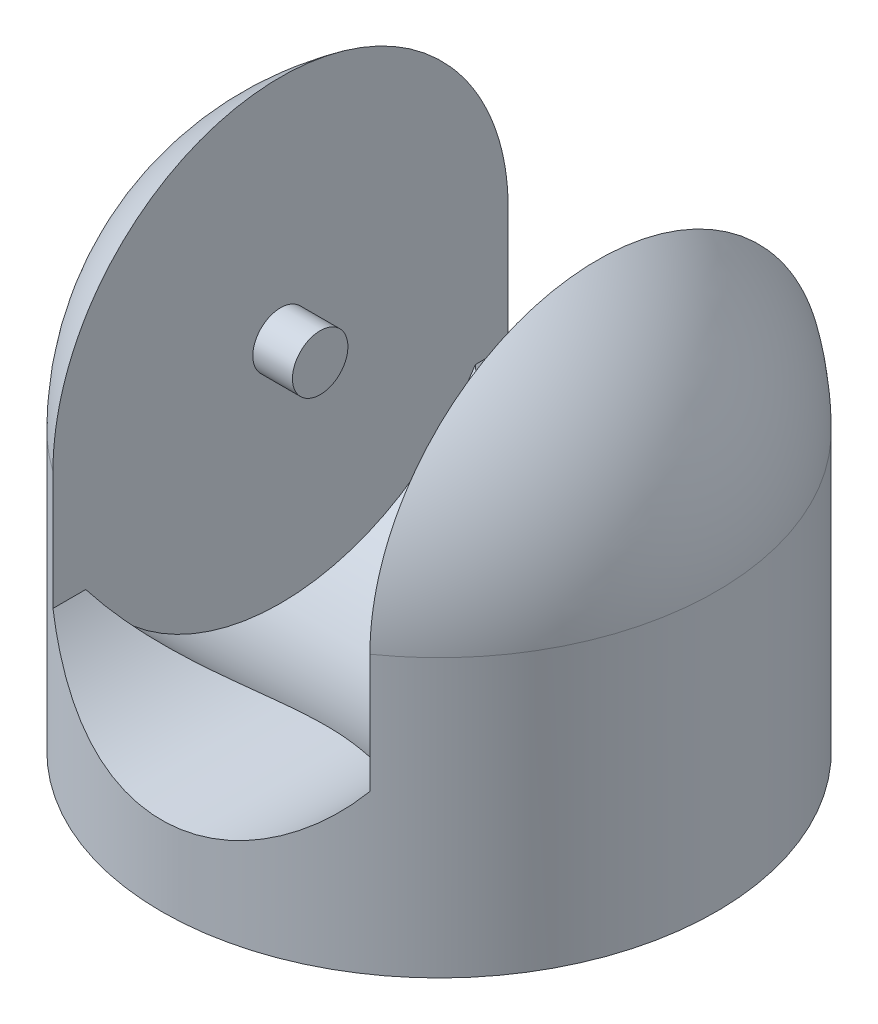
ISO-10303-21;
HEADER;
FILE_DESCRIPTION(('STEP AP214'),'2;1');
FILE_NAME('part.step','',(''),(''),'','','');
FILE_SCHEMA(('AUTOMOTIVE_DESIGN { 1 0 10303 214 1 1 1 1 }'));
ENDSEC;
DATA;
#1=APPLICATION_CONTEXT('core data for automotive mechanical design processes');
#2=APPLICATION_PROTOCOL_DEFINITION('international standard','automotive_design',2000,#1);
#3=PRODUCT_CONTEXT('',#1,'mechanical');
#4=PRODUCT('Part','Part','',(#3));
#5=PRODUCT_RELATED_PRODUCT_CATEGORY('part','',(#4));
#6=PRODUCT_DEFINITION_FORMATION('','',#4);
#7=PRODUCT_DEFINITION_CONTEXT('part definition',#1,'design');
#8=PRODUCT_DEFINITION('design','',#6,#7);
#9=PRODUCT_DEFINITION_SHAPE('','',#8);
#10=(LENGTH_UNIT() NAMED_UNIT(*) SI_UNIT(.MILLI.,.METRE.));
#11=(NAMED_UNIT(*) PLANE_ANGLE_UNIT() SI_UNIT($,.RADIAN.));
#12=(NAMED_UNIT(*) SI_UNIT($,.STERADIAN.) SOLID_ANGLE_UNIT());
#13=UNCERTAINTY_MEASURE_WITH_UNIT(LENGTH_MEASURE(1.E-05),#10,'distance_accuracy_value','');
#14=(GEOMETRIC_REPRESENTATION_CONTEXT(3) GLOBAL_UNCERTAINTY_ASSIGNED_CONTEXT((#13)) GLOBAL_UNIT_ASSIGNED_CONTEXT((#10,
#11,#12)) REPRESENTATION_CONTEXT('',''));
#15=CARTESIAN_POINT('',(0.,0.,0.));
#16=DIRECTION('',(0.,0.,1.));
#17=DIRECTION('',(1.,0.,0.));
#18=AXIS2_PLACEMENT_3D('',#15,#16,#17);
#19=CARTESIAN_POINT('',(-20.,70.,-28.7228132326902));
#20=DIRECTION('',(-1.,0.,0.));
#21=DIRECTION('',(0.,0.,1.));
#22=AXIS2_PLACEMENT_3D('',#19,#20,#21);
#23=PLANE('',#22);
#24=DIRECTION('',(0.,-1.,0.));
#25=VECTOR('',#24,1.);
#26=CARTESIAN_POINT('',(-20.,70.,28.7228132326902));
#27=LINE('',#26,#25);
#28=CARTESIAN_POINT('',(-20.,35.,28.7228132326901));
#29=VERTEX_POINT('',#28);
#30=CARTESIAN_POINT('',(-20.,20.,28.7228132326902));
#31=VERTEX_POINT('',#30);
#32=EDGE_CURVE('E121',#29,#31,#27,.T.);
#33=ORIENTED_EDGE('',*,*,#32,.T.);
#34=DIRECTION('',(0.,0.,1.));
#35=VECTOR('',#34,1.);
#36=CARTESIAN_POINT('',(-20.,20.,-35.001));
#37=LINE('',#36,#35);
#38=CARTESIAN_POINT('',(-20.,20.,24.584133540962));
#39=VERTEX_POINT('',#38);
#40=EDGE_CURVE('E109',#39,#31,#37,.T.);
#41=ORIENTED_EDGE('',*,*,#40,.F.);
#42=CARTESIAN_POINT('',(-20.,35.,0.));
#43=DIRECTION('',(1.,0.,0.));
#44=DIRECTION('',(0.,0.,-1.));
#45=AXIS2_PLACEMENT_3D('',#42,#43,#44);
#46=CIRCLE('',#45,28.7989517510595);
#47=CARTESIAN_POINT('',(-20.,20.,-24.584133540962));
#48=VERTEX_POINT('',#47);
#49=EDGE_CURVE('E94',#39,#48,#46,.T.);
#50=ORIENTED_EDGE('',*,*,#49,.T.);
#51=CARTESIAN_POINT('',(-20.,20.,-28.7228132326902));
#52=VERTEX_POINT('',#51);
#53=EDGE_CURVE('E103',#52,#48,#37,.T.);
#54=ORIENTED_EDGE('',*,*,#53,.F.);
#55=DIRECTION('',(0.,-1.,0.));
#56=VECTOR('',#55,1.);
#57=CARTESIAN_POINT('',(-20.,70.,-28.7228132326901));
#58=LINE('',#57,#56);
#59=CARTESIAN_POINT('',(-20.,35.,-28.7228132326902));
#60=VERTEX_POINT('',#59);
#61=EDGE_CURVE('E57',#60,#52,#58,.T.);
#62=ORIENTED_EDGE('',*,*,#61,.F.);
#63=CARTESIAN_POINT('',(-20.,35.,0.));
#64=DIRECTION('',(-1.,0.,0.));
#65=DIRECTION('',(0.,0.,1.));
#66=AXIS2_PLACEMENT_3D('',#63,#64,#65);
#67=CIRCLE('',#66,28.7228132326902);
#68=EDGE_CURVE('E130',#60,#29,#67,.F.);
#69=ORIENTED_EDGE('',*,*,#68,.T.);
#70=EDGE_LOOP('',(#33,#41,#50,#54,#62,#69));
#71=FACE_BOUND('',#70,.T.);
#72=CARTESIAN_POINT('',(-20.,35.,0.));
#73=DIRECTION('',(-1.,0.,0.));
#74=DIRECTION('',(0.,0.,1.));
#75=AXIS2_PLACEMENT_3D('',#72,#73,#74);
#76=CIRCLE('',#75,3.5);
#77=CARTESIAN_POINT('',(-20.,35.,3.5));
#78=VERTEX_POINT('',#77);
#79=EDGE_CURVE('E11',#78,#78,#76,.F.);
#80=ORIENTED_EDGE('',*,*,#79,.F.);
#81=EDGE_LOOP('',(#80));
#82=FACE_BOUND('',#81,.T.);
#83=ADVANCED_FACE('F34',(#71,#82),#23,.F.);
#84=CARTESIAN_POINT('',(20.,70.,-28.7228132326902));
#85=DIRECTION('',(1.,0.,0.));
#86=DIRECTION('',(0.,0.,-1.));
#87=AXIS2_PLACEMENT_3D('',#84,#85,#86);
#88=PLANE('',#87);
#89=DIRECTION('',(0.,-1.,0.));
#90=VECTOR('',#89,1.);
#91=CARTESIAN_POINT('',(20.,70.,-28.7228132326902));
#92=LINE('',#91,#90);
#93=CARTESIAN_POINT('',(20.,35.,-28.7228132326902));
#94=VERTEX_POINT('',#93);
#95=CARTESIAN_POINT('',(20.,20.,-28.7228132326902));
#96=VERTEX_POINT('',#95);
#97=EDGE_CURVE('E108',#94,#96,#92,.T.);
#98=ORIENTED_EDGE('',*,*,#97,.T.);
#99=DIRECTION('',(0.,0.,1.));
#100=VECTOR('',#99,1.);
#101=CARTESIAN_POINT('',(20.,20.,-35.001));
#102=LINE('',#101,#100);
#103=CARTESIAN_POINT('',(20.,20.,-24.584133540962));
#104=VERTEX_POINT('',#103);
#105=EDGE_CURVE('E101',#96,#104,#102,.T.);
#106=ORIENTED_EDGE('',*,*,#105,.T.);
#107=CARTESIAN_POINT('',(20.,35.,0.));
#108=DIRECTION('',(1.,0.,0.));
#109=DIRECTION('',(0.,0.,-1.));
#110=AXIS2_PLACEMENT_3D('',#107,#108,#109);
#111=CIRCLE('',#110,28.7989517510595);
#112=CARTESIAN_POINT('',(20.,20.,24.584133540962));
#113=VERTEX_POINT('',#112);
#114=EDGE_CURVE('E49',#113,#104,#111,.T.);
#115=ORIENTED_EDGE('',*,*,#114,.F.);
#116=CARTESIAN_POINT('',(20.,20.,28.7228132326902));
#117=VERTEX_POINT('',#116);
#118=EDGE_CURVE('E110',#113,#117,#102,.T.);
#119=ORIENTED_EDGE('',*,*,#118,.T.);
#120=DIRECTION('',(0.,-1.,0.));
#121=VECTOR('',#120,1.);
#122=CARTESIAN_POINT('',(20.,70.,28.7228132326902));
#123=LINE('',#122,#121);
#124=CARTESIAN_POINT('',(20.,35.,28.7228132326901));
#125=VERTEX_POINT('',#124);
#126=EDGE_CURVE('E116',#125,#117,#123,.T.);
#127=ORIENTED_EDGE('',*,*,#126,.F.);
#128=CARTESIAN_POINT('',(20.,35.,0.));
#129=DIRECTION('',(1.,0.,0.));
#130=DIRECTION('',(0.,0.,-1.));
#131=AXIS2_PLACEMENT_3D('',#128,#129,#130);
#132=CIRCLE('',#131,28.7228132326902);
#133=EDGE_CURVE('E132',#125,#94,#132,.F.);
#134=ORIENTED_EDGE('',*,*,#133,.T.);
#135=EDGE_LOOP('',(#98,#106,#115,#119,#127,#134));
#136=FACE_BOUND('',#135,.T.);
#137=CARTESIAN_POINT('',(20.,35.,0.));
#138=DIRECTION('',(1.,0.,0.));
#139=DIRECTION('',(0.,0.,-1.));
#140=AXIS2_PLACEMENT_3D('',#137,#138,#139);
#141=CIRCLE('',#140,3.5);
#142=CARTESIAN_POINT('',(20.,35.,-3.5));
#143=VERTEX_POINT('',#142);
#144=EDGE_CURVE('E42',#143,#143,#141,.F.);
#145=ORIENTED_EDGE('',*,*,#144,.F.);
#146=EDGE_LOOP('',(#145));
#147=FACE_BOUND('',#146,.T.);
#148=ADVANCED_FACE('F105',(#136,#147),#88,.F.);
#149=CARTESIAN_POINT('',(0.,35.,-35.001));
#150=DIRECTION('',(0.,0.,1.));
#151=DIRECTION('',(1.,0.,0.));
#152=AXIS2_PLACEMENT_3D('',#149,#150,#151);
#153=CYLINDRICAL_SURFACE('',#152,25.);
#154=CARTESIAN_POINT('',(20.,20.,-24.584133540962));
#155=CARTESIAN_POINT('',(19.7589653789636,19.6786366468955,-24.3880564833541));
#156=CARTESIAN_POINT('',(19.5114349361079,19.3647169685228,-24.1878689528644));
#157=CARTESIAN_POINT('',(19.0040804331311,18.7518221809919,-23.7804894937621));
#158=CARTESIAN_POINT('',(18.7442586649229,18.4528443069112,-23.5732988730279));
#159=CARTESIAN_POINT('',(18.2130593881842,17.8699134903597,-23.1531587875243));
#160=CARTESIAN_POINT('',(17.9416875908679,17.5859532742746,-22.9402121875294));
#161=CARTESIAN_POINT('',(17.3877921141745,17.0328672121599,-22.5096571640812));
#162=CARTESIAN_POINT('',(17.1052678778502,16.7637421086007,-22.292048508056));
#163=CARTESIAN_POINT('',(16.2368961770555,15.9742576457032,-21.630402596932));
#164=CARTESIAN_POINT('',(15.6344501435017,15.4763853121027,-21.1808943088864));
#165=CARTESIAN_POINT('',(14.6996071008935,14.7744388551671,-20.5039555667599));
#166=CARTESIAN_POINT('',(14.3827663484432,14.5479148387515,-20.2778422356288));
#167=CARTESIAN_POINT('',(13.7385898907949,14.1097421789252,-19.8261371751175));
#168=CARTESIAN_POINT('',(13.411254636511,13.8980928976404,-19.6005454237721));
#169=CARTESIAN_POINT('',(12.5784043993165,13.3868465979377,-19.0383641858032));
#170=CARTESIAN_POINT('',(12.0661819698894,13.0966422175,-18.7030949092357));
#171=CARTESIAN_POINT('',(11.0167362555379,12.5504673895574,-18.0438723349398));
#172=CARTESIAN_POINT('',(10.479511483911,12.2944989813246,-17.7199197121385));
#173=CARTESIAN_POINT('',(9.37975019250803,11.8185777383216,-17.0925602673537));
#174=CARTESIAN_POINT('',(8.8172876150202,11.5985274632825,-16.7890992136669));
#175=CARTESIAN_POINT('',(7.95239222705756,11.2965728366188,-16.3572050987599));
#176=CARTESIAN_POINT('',(7.66062957084739,11.2006268886144,-16.2171527771733));
#177=CARTESIAN_POINT('',(7.06976487628542,11.0184618654417,-15.9465380614054));
#178=CARTESIAN_POINT('',(6.77066148742319,10.9322445966876,-15.8159774312302));
#179=CARTESIAN_POINT('',(5.74786213349781,10.658336029013,-15.3944063650927));
#180=CARTESIAN_POINT('',(5.00593241700046,10.4941526903562,-15.1296629003441));
#181=CARTESIAN_POINT('',(3.86520825472443,10.2975944851878,-14.8049650337621));
#182=CARTESIAN_POINT('',(3.48071665635592,10.2403928182495,-14.7088604508359));
#183=CARTESIAN_POINT('',(2.70349877245001,10.1435263254106,-14.5445668408579));
#184=CARTESIAN_POINT('',(2.31077278183142,10.1038608725618,-14.4763768158217));
#185=CARTESIAN_POINT('',(1.51506527539025,10.0427241612041,-14.3707288670768));
#186=CARTESIAN_POINT('',(1.11201759053807,10.021470143467,-14.3336380496131));
#187=CARTESIAN_POINT('',(0.303669194317217,9.99857556550272,-14.2936680916078));
#188=CARTESIAN_POINT('',(-0.101631350491607,9.99693357410638,-14.2907864546833));
#189=CARTESIAN_POINT('',(-0.910857478856325,10.0133188124471,-14.3194148966694));
#190=CARTESIAN_POINT('',(-1.3147820097582,10.0313587003671,-14.3509471084704));
#191=CARTESIAN_POINT('',(-2.11741342144235,10.0865800495237,-14.4465953818876));
#192=CARTESIAN_POINT('',(-2.516119416571,10.1237647177711,-14.5107169026328));
#193=CARTESIAN_POINT('',(-3.37177773736056,10.2240740567088,-14.681432743667));
#194=CARTESIAN_POINT('',(-3.82727293240221,10.2905052697267,-14.7933498053317));
#195=CARTESIAN_POINT('',(-4.72466502388315,10.4462796777479,-15.0504792129497));
#196=CARTESIAN_POINT('',(-5.16655817444798,10.5356291220962,-15.1957006391936));
#197=CARTESIAN_POINT('',(-6.03710471933982,10.7357556679278,-15.5132646273062));
#198=CARTESIAN_POINT('',(-6.46570885586816,10.8466034792206,-15.6856963272074));
#199=CARTESIAN_POINT('',(-7.30832545950768,11.0880662009588,-16.0513878032181));
#200=CARTESIAN_POINT('',(-7.72233177795081,11.2186893210746,-16.2446562200015));
#201=CARTESIAN_POINT('',(-8.47915783042321,11.4789284468832,-16.6187623968556));
#202=CARTESIAN_POINT('',(-8.82383317822576,11.6061284298613,-16.7975561313935));
#203=CARTESIAN_POINT('',(-9.50304557815312,11.8737091128119,-17.1640835933644));
#204=CARTESIAN_POINT('',(-9.8375846450484,12.0140871703645,-17.3518155248377));
#205=CARTESIAN_POINT('',(-10.4972704183337,12.3077597406237,-17.7341477402505));
#206=CARTESIAN_POINT('',(-10.8224103334665,12.4610632940033,-17.9287527753262));
#207=CARTESIAN_POINT('',(-11.4634489488312,12.7802450803104,-18.322840456102));
#208=CARTESIAN_POINT('',(-11.7793466289606,12.9461246941055,-18.5223236357948));
#209=CARTESIAN_POINT('',(-12.7134706260121,13.4622623677701,-19.1255091405389));
#210=CARTESIAN_POINT('',(-13.3183835976166,13.8311336268286,-19.5340985662206));
#211=CARTESIAN_POINT('',(-14.4934675724428,14.6176818565859,-20.3534628155087));
#212=CARTESIAN_POINT('',(-15.0636522165604,15.0353394739937,-20.7642367112398));
#213=CARTESIAN_POINT('',(-16.0218305731036,15.8018148170097,-21.4710046379384));
#214=CARTESIAN_POINT('',(-16.4178780674206,16.1393099516465,-21.7684097324855));
#215=CARTESIAN_POINT('',(-17.1905735942009,16.84080381236,-22.3569402484533));
#216=CARTESIAN_POINT('',(-17.5672253219851,17.2047974577511,-22.6480668598746));
#217=CARTESIAN_POINT('',(-18.2991907589498,17.9584374903988,-23.2204222198885));
#218=CARTESIAN_POINT('',(-18.6545610261832,18.3480095352001,-23.5016762988118));
#219=CARTESIAN_POINT('',(-19.3438137178225,19.1539364228621,-24.052450458555));
#220=CARTESIAN_POINT('',(-19.6776860259696,19.5703036930909,-24.3219649960966));
#221=CARTESIAN_POINT('',(-20.,20.,-24.584133540962));
#222=B_SPLINE_CURVE_WITH_KNOTS('',3,(#154,#155,#156,#157,#158,#159,#160,#161,#162,#163,#164,
#165,#166,#167,#168,#169,#170,#171,#172,#173,#174,#175,#176,#177,#178,#179,#180,#181,#182,#183,
#184,#185,#186,#187,#188,#189,#190,#191,#192,#193,#194,#195,#196,#197,#198,#199,#200,#201,#202,
#203,#204,#205,#206,#207,#208,#209,#210,#211,#212,#213,#214,#215,#216,#217,#218,#219,#220,#221),
.UNSPECIFIED.,.F.,.F.,(4,2,2,2,2,2,2,2,2,2,2,2,2,2,2,2,2,2,2,2,2,2,2,2,2,2,2,2,2,2,2,2,2,4),(0.,
1.34083418658437,2.68141933131193,4.02134911966647,5.36134590830584,8.06248486995453,
9.41330418959865,10.7640655466025,12.7951363068786,14.826327994447,16.8519143471984,
17.8642429496709,18.8767592123561,21.2817109757442,22.4818508998739,23.6819479135765,
24.8960194609212,26.110002411988,27.3247665832532,28.5397343102622,29.9586469854788,
31.3779469819813,32.8019968556765,34.2266395495736,35.4519602603511,36.6770357969146,
37.902975430101,39.1290498685346,41.5802464840048,44.0304740040326,45.8276292414617,
47.6244408047136,49.416243291642,51.2088828733624),.UNSPECIFIED.);
#223=EDGE_CURVE('E88',#104,#48,#222,.T.);
#224=ORIENTED_EDGE('',*,*,#223,.F.);
#225=ORIENTED_EDGE('',*,*,#105,.F.);
#226=CARTESIAN_POINT('',(20.,20.,-28.7228132326902));
#227=CARTESIAN_POINT('',(19.7867962339921,19.7157430015077,-28.8712717207238));
#228=CARTESIAN_POINT('',(19.5677151221583,19.4362460841641,-29.0202922477165));
#229=CARTESIAN_POINT('',(19.1179059235667,18.8869055196819,-29.3185689368627));
#230=CARTESIAN_POINT('',(18.8871775930187,18.6170620748042,-29.4678251038848));
#231=CARTESIAN_POINT('',(18.1775107964694,17.8220204411887,-29.9147222896041));
#232=CARTESIAN_POINT('',(17.6812586784095,17.3115351365177,-30.2113736200101));
#233=CARTESIAN_POINT('',(16.6387448278238,16.3272573415269,-30.7979486038796));
#234=CARTESIAN_POINT('',(16.0920266241455,15.8538898732128,-31.0877734100756));
#235=CARTESIAN_POINT('',(14.954306369625,14.9526769048786,-31.6507730169713));
#236=CARTESIAN_POINT('',(14.363310896601,14.5248246658932,-31.9239502799336));
#237=CARTESIAN_POINT('',(13.1358689121121,13.7164023424612,-32.4483661287183));
#238=CARTESIAN_POINT('',(12.4992159229297,13.3360715653495,-32.6994919221283));
#239=CARTESIAN_POINT('',(11.1857605875011,12.6296021915462,-33.171760439479));
#240=CARTESIAN_POINT('',(10.5089559758877,12.3034666565206,-33.3929014693529));
#241=CARTESIAN_POINT('',(9.12231507425886,11.711609639635,-33.7979699877076));
#242=CARTESIAN_POINT('',(8.4126325401201,11.4456355861555,-33.9820526831074));
#243=CARTESIAN_POINT('',(6.96329660834398,10.9772606449588,-34.3083624793697));
#244=CARTESIAN_POINT('',(6.2236507608461,10.7748438532353,-34.4506000506228));
#245=CARTESIAN_POINT('',(4.82993892314189,10.4621541405979,-34.6712491830646));
#246=CARTESIAN_POINT('',(4.17888382128421,10.3428105895907,-34.7559017295164));
#247=CARTESIAN_POINT('',(2.86569486680995,10.1559377984981,-34.8887241302945));
#248=CARTESIAN_POINT('',(2.20356213029851,10.0884033702303,-34.9368976376375));
#249=CARTESIAN_POINT('',(0.874273029809522,10.0064172309871,-34.9954048484337));
#250=CARTESIAN_POINT('',(0.207116079249498,9.99197181759536,-35.0057340626789));
#251=CARTESIAN_POINT('',(-1.12568740919334,10.016466627178,-34.9882387259323));
#252=CARTESIAN_POINT('',(-1.79133406608786,10.0554024861974,-34.9604172937816));
#253=CARTESIAN_POINT('',(-3.02730731825966,10.1772554202841,-34.8735879130262));
#254=CARTESIAN_POINT('',(-3.59861524094893,10.253686739426,-34.8191826355172));
#255=CARTESIAN_POINT('',(-4.73141381489224,10.4450899903135,-34.6834116753889));
#256=CARTESIAN_POINT('',(-5.29290559242344,10.5600574695839,-34.6020491074324));
#257=CARTESIAN_POINT('',(-6.40245377638835,10.826996011538,-34.4140256091646));
#258=CARTESIAN_POINT('',(-6.95051459474932,10.9789547386781,-34.3073731126416));
#259=CARTESIAN_POINT('',(-8.03045417788177,11.3181043180312,-34.0707708709449));
#260=CARTESIAN_POINT('',(-8.56233201655212,11.5052971821946,-33.9408197953889));
#261=CARTESIAN_POINT('',(-9.62943898275283,11.9215342863996,-33.6540024012869));
#262=CARTESIAN_POINT('',(-10.1638662753343,12.1520088245027,-33.4962331933269));
#263=CARTESIAN_POINT('',(-11.21025741663,12.6468093723142,-33.1607007025862));
#264=CARTESIAN_POINT('',(-11.7222206006461,12.9111363827893,-32.9829368287305));
#265=CARTESIAN_POINT('',(-12.7226472594927,13.471797738056,-32.610114905573));
#266=CARTESIAN_POINT('',(-13.2110796609338,13.7681728148127,-32.4150349058213));
#267=CARTESIAN_POINT('',(-14.1625320097457,14.3906347533945,-32.0107781205752));
#268=CARTESIAN_POINT('',(-14.6255495071029,14.7167244716984,-31.8015999803259));
#269=CARTESIAN_POINT('',(-15.5462259244498,15.4126765633273,-31.3621911315634));
#270=CARTESIAN_POINT('',(-16.0026248380218,15.7838719457879,-31.1314334635424));
#271=CARTESIAN_POINT('',(-16.8857478077068,16.5550746337831,-30.6614054804088));
#272=CARTESIAN_POINT('',(-17.312469099194,16.9550846165011,-30.422134375355));
#273=CARTESIAN_POINT('',(-18.133989306158,17.7809310410455,-29.9396796325053));
#274=CARTESIAN_POINT('',(-18.5289041275662,18.2066627978581,-29.6965144700605));
#275=CARTESIAN_POINT('',(-19.0980722397497,18.8647054678806,-29.3311182161552));
#276=CARTESIAN_POINT('',(-19.2839141530429,19.0872759497597,-29.2092208053957));
#277=CARTESIAN_POINT('',(-19.6478127346763,19.5388393443364,-28.9656933891444));
#278=CARTESIAN_POINT('',(-19.8258693229324,19.7678323230596,-28.8440633864155));
#279=CARTESIAN_POINT('',(-20.,20.,-28.7228132326901));
#280=B_SPLINE_CURVE_WITH_KNOTS('',3,(#226,#227,#228,#229,#230,#231,#232,#233,#234,#235,#236,
#237,#238,#239,#240,#241,#242,#243,#244,#245,#246,#247,#248,#249,#250,#251,#252,#253,#254,#255,
#256,#257,#258,#259,#260,#261,#262,#263,#264,#265,#266,#267,#268,#269,#270,#271,#272,#273,#274,
#275,#276,#277,#278,#279),.UNSPECIFIED.,.F.,.F.,(4,2,2,2,2,2,2,2,2,2,2,2,2,2,2,2,2,2,2,2,2,2,2,
2,2,2,4),(0.,1.15512375906846,2.31027170629091,4.62147770219639,6.95614236370478,
9.29046087325038,11.6360974113601,13.9818664171148,16.3175966000099,18.652741843818,
20.6516794741274,22.6504169040279,24.6493914227111,26.6482025336243,28.3831036458536,
30.1178043763406,31.8519274233357,33.5861495228056,35.3933915222295,37.2006869607382,
39.0103070240176,40.8201012305859,42.7144117327994,44.6088984642307,46.4961357401291,
47.4396088702414,48.3830917031511),.UNSPECIFIED.);
#281=EDGE_CURVE('E123',#96,#52,#280,.T.);
#282=ORIENTED_EDGE('',*,*,#281,.T.);
#283=ORIENTED_EDGE('',*,*,#53,.T.);
#284=EDGE_LOOP('',(#224,#225,#282,#283));
#285=FACE_BOUND('',#284,.T.);
#286=ADVANCED_FACE('F99',(#285),#153,.F.);
#287=CARTESIAN_POINT('',(-20.,20.,24.584133540962));
#288=CARTESIAN_POINT('',(-19.7589653789637,19.6786366468955,24.3880564833541));
#289=CARTESIAN_POINT('',(-19.5114349361079,19.3647169685228,24.1878689528644));
#290=CARTESIAN_POINT('',(-19.0040804331311,18.7518221809919,23.7804894937621));
#291=CARTESIAN_POINT('',(-18.7442586649229,18.4528443069112,23.5732988730279));
#292=CARTESIAN_POINT('',(-18.2130593881842,17.8699134903597,23.1531587875243));
#293=CARTESIAN_POINT('',(-17.9416875908679,17.5859532742746,22.9402121875294));
#294=CARTESIAN_POINT('',(-17.3877921141745,17.0328672121599,22.5096571640812));
#295=CARTESIAN_POINT('',(-17.1052678778503,16.7637421086007,22.292048508056));
#296=CARTESIAN_POINT('',(-16.2368961770555,15.9742576457032,21.6304025969319));
#297=CARTESIAN_POINT('',(-15.6344501435017,15.4763853121027,21.1808943088864));
#298=CARTESIAN_POINT('',(-14.6996071008935,14.7744388551671,20.5039555667599));
#299=CARTESIAN_POINT('',(-14.3827663484432,14.5479148387515,20.2778422356288));
#300=CARTESIAN_POINT('',(-13.738589890795,14.1097421789252,19.8261371751175));
#301=CARTESIAN_POINT('',(-13.411254636511,13.8980928976404,19.6005454237721));
#302=CARTESIAN_POINT('',(-12.5784043993165,13.3868465979377,19.0383641858032));
#303=CARTESIAN_POINT('',(-12.0661819698895,13.0966422175,18.7030949092357));
#304=CARTESIAN_POINT('',(-11.0167362555379,12.5504673895574,18.0438723349398));
#305=CARTESIAN_POINT('',(-10.479511483911,12.2944989813246,17.7199197121385));
#306=CARTESIAN_POINT('',(-9.37975019250804,11.8185777383216,17.0925602673537));
#307=CARTESIAN_POINT('',(-8.8172876150202,11.5985274632825,16.7890992136668));
#308=CARTESIAN_POINT('',(-7.95239222705757,11.2965728366188,16.3572050987599));
#309=CARTESIAN_POINT('',(-7.6606295708474,11.2006268886144,16.2171527771733));
#310=CARTESIAN_POINT('',(-7.06976487628543,11.0184618654417,15.9465380614054));
#311=CARTESIAN_POINT('',(-6.7706614874232,10.9322445966876,15.8159774312302));
#312=CARTESIAN_POINT('',(-5.74786213349781,10.658336029013,15.3944063650927));
#313=CARTESIAN_POINT('',(-5.00593241700046,10.4941526903562,15.1296629003441));
#314=CARTESIAN_POINT('',(-3.86520825472443,10.2975944851878,14.804965033762));
#315=CARTESIAN_POINT('',(-3.48071665635593,10.2403928182495,14.7088604508359));
#316=CARTESIAN_POINT('',(-2.70349877245001,10.1435263254106,14.5445668408579));
#317=CARTESIAN_POINT('',(-2.31077278183142,10.1038608725618,14.4763768158217));
#318=CARTESIAN_POINT('',(-1.51506527539026,10.0427241612041,14.3707288670768));
#319=CARTESIAN_POINT('',(-1.11201759053808,10.021470143467,14.3336380496131));
#320=CARTESIAN_POINT('',(-0.303669194317219,9.99857556550272,14.2936680916078));
#321=CARTESIAN_POINT('',(0.101631350491606,9.99693357410637,14.2907864546833));
#322=CARTESIAN_POINT('',(0.910857478856325,10.0133188124471,14.3194148966694));
#323=CARTESIAN_POINT('',(1.3147820097582,10.0313587003671,14.3509471084704));
#324=CARTESIAN_POINT('',(2.11741342144235,10.0865800495237,14.4465953818876));
#325=CARTESIAN_POINT('',(2.516119416571,10.1237647177711,14.5107169026327));
#326=CARTESIAN_POINT('',(3.37177773736056,10.2240740567088,14.681432743667));
#327=CARTESIAN_POINT('',(3.82727293240221,10.2905052697267,14.7933498053317));
#328=CARTESIAN_POINT('',(4.72466502388315,10.4462796777479,15.0504792129496));
#329=CARTESIAN_POINT('',(5.16655817444798,10.5356291220962,15.1957006391936));
#330=CARTESIAN_POINT('',(6.03710471933982,10.7357556679278,15.5132646273062));
#331=CARTESIAN_POINT('',(6.46570885586816,10.8466034792205,15.6856963272074));
#332=CARTESIAN_POINT('',(7.30832545950768,11.0880662009588,16.0513878032181));
#333=CARTESIAN_POINT('',(7.72233177795081,11.2186893210746,16.2446562200014));
#334=CARTESIAN_POINT('',(8.47915783042321,11.4789284468832,16.6187623968556));
#335=CARTESIAN_POINT('',(8.82383317822576,11.6061284298613,16.7975561313935));
#336=CARTESIAN_POINT('',(9.50304557815313,11.8737091128119,17.1640835933644));
#337=CARTESIAN_POINT('',(9.83758464504841,12.0140871703645,17.3518155248377));
#338=CARTESIAN_POINT('',(10.4972704183337,12.3077597406237,17.7341477402505));
#339=CARTESIAN_POINT('',(10.8224103334666,12.4610632940034,17.9287527753262));
#340=CARTESIAN_POINT('',(11.4634489488312,12.7802450803104,18.322840456102));
#341=CARTESIAN_POINT('',(11.7793466289606,12.9461246941055,18.5223236357948));
#342=CARTESIAN_POINT('',(12.7134706260121,13.4622623677701,19.1255091405389));
#343=CARTESIAN_POINT('',(13.3183835976166,13.8311336268286,19.5340985662206));
#344=CARTESIAN_POINT('',(14.4934675724428,14.6176818565859,20.3534628155087));
#345=CARTESIAN_POINT('',(15.0636522165604,15.0353394739937,20.7642367112398));
#346=CARTESIAN_POINT('',(16.0218305731036,15.8018148170097,21.4710046379384));
#347=CARTESIAN_POINT('',(16.4178780674206,16.1393099516465,21.7684097324855));
#348=CARTESIAN_POINT('',(17.1905735942009,16.84080381236,22.3569402484533));
#349=CARTESIAN_POINT('',(17.5672253219851,17.2047974577511,22.6480668598745));
#350=CARTESIAN_POINT('',(18.2991907589498,17.9584374903988,23.2204222198885));
#351=CARTESIAN_POINT('',(18.6545610261832,18.3480095352001,23.5016762988118));
#352=CARTESIAN_POINT('',(19.3438137178225,19.1539364228621,24.052450458555));
#353=CARTESIAN_POINT('',(19.6776860259696,19.5703036930909,24.3219649960966));
#354=CARTESIAN_POINT('',(20.,20.,24.584133540962));
#355=B_SPLINE_CURVE_WITH_KNOTS('',3,(#287,#288,#289,#290,#291,#292,#293,#294,#295,#296,#297,
#298,#299,#300,#301,#302,#303,#304,#305,#306,#307,#308,#309,#310,#311,#312,#313,#314,#315,#316,
#317,#318,#319,#320,#321,#322,#323,#324,#325,#326,#327,#328,#329,#330,#331,#332,#333,#334,#335,
#336,#337,#338,#339,#340,#341,#342,#343,#344,#345,#346,#347,#348,#349,#350,#351,#352,#353,#354),
.UNSPECIFIED.,.F.,.F.,(4,2,2,2,2,2,2,2,2,2,2,2,2,2,2,2,2,2,2,2,2,2,2,2,2,2,2,2,2,2,2,2,2,4),(0.,
1.34083418658437,2.68141933131193,4.02134911966647,5.36134590830584,8.06248486995453,
9.41330418959864,10.7640655466025,12.7951363068786,14.826327994447,16.8519143471984,
17.8642429496709,18.8767592123561,21.2817109757442,22.4818508998739,23.6819479135765,
24.8960194609212,26.110002411988,27.3247665832532,28.5397343102622,29.9586469854788,
31.3779469819814,32.8019968556765,34.2266395495736,35.4519602603511,36.6770357969146,
37.902975430101,39.1290498685346,41.5802464840048,44.0304740040326,45.8276292414617,
47.6244408047136,49.416243291642,51.2088828733624),.UNSPECIFIED.);
#356=EDGE_CURVE('E91',#39,#113,#355,.T.);
#357=ORIENTED_EDGE('',*,*,#356,.F.);
#358=ORIENTED_EDGE('',*,*,#40,.T.);
#359=CARTESIAN_POINT('',(20.,20.,28.7228132326901));
#360=CARTESIAN_POINT('',(19.7867962339921,19.7157430015077,28.8712717207237));
#361=CARTESIAN_POINT('',(19.5677151221583,19.4362460841641,29.0202922477165));
#362=CARTESIAN_POINT('',(19.1179059235667,18.8869055196819,29.3185689368627));
#363=CARTESIAN_POINT('',(18.8871775930187,18.6170620748042,29.4678251038848));
#364=CARTESIAN_POINT('',(18.1775107964694,17.8220204411887,29.9147222896041));
#365=CARTESIAN_POINT('',(17.6812586784095,17.3115351365177,30.2113736200101));
#366=CARTESIAN_POINT('',(16.6387448278238,16.3272573415269,30.7979486038796));
#367=CARTESIAN_POINT('',(16.0920266241455,15.8538898732128,31.0877734100756));
#368=CARTESIAN_POINT('',(14.954306369625,14.9526769048787,31.6507730169713));
#369=CARTESIAN_POINT('',(14.363310896601,14.5248246658932,31.9239502799336));
#370=CARTESIAN_POINT('',(13.1358689121122,13.7164023424612,32.4483661287183));
#371=CARTESIAN_POINT('',(12.4992159229297,13.3360715653495,32.6994919221283));
#372=CARTESIAN_POINT('',(11.1857605875011,12.6296021915462,33.171760439479));
#373=CARTESIAN_POINT('',(10.5089559758877,12.3034666565206,33.3929014693529));
#374=CARTESIAN_POINT('',(9.12231507425887,11.711609639635,33.7979699877076));
#375=CARTESIAN_POINT('',(8.41263254012011,11.4456355861555,33.9820526831074));
#376=CARTESIAN_POINT('',(6.96329660834399,10.9772606449588,34.3083624793697));
#377=CARTESIAN_POINT('',(6.22365076084611,10.7748438532353,34.4506000506228));
#378=CARTESIAN_POINT('',(4.8299389231419,10.4621541405979,34.6712491830646));
#379=CARTESIAN_POINT('',(4.17888382128422,10.3428105895907,34.7559017295164));
#380=CARTESIAN_POINT('',(2.86569486680995,10.1559377984981,34.8887241302945));
#381=CARTESIAN_POINT('',(2.20356213029851,10.0884033702303,34.9368976376375));
#382=CARTESIAN_POINT('',(0.874273029809528,10.0064172309871,34.9954048484337));
#383=CARTESIAN_POINT('',(0.207116079249504,9.99197181759536,35.0057340626789));
#384=CARTESIAN_POINT('',(-1.12568740919334,10.016466627178,34.9882387259323));
#385=CARTESIAN_POINT('',(-1.79133406608785,10.0554024861974,34.9604172937816));
#386=CARTESIAN_POINT('',(-3.02730731825965,10.1772554202841,34.8735879130262));
#387=CARTESIAN_POINT('',(-3.59861524094892,10.253686739426,34.8191826355172));
#388=CARTESIAN_POINT('',(-4.73141381489223,10.4450899903135,34.6834116753889));
#389=CARTESIAN_POINT('',(-5.29290559242344,10.5600574695839,34.6020491074324));
#390=CARTESIAN_POINT('',(-6.40245377638835,10.826996011538,34.4140256091646));
#391=CARTESIAN_POINT('',(-6.95051459474932,10.9789547386781,34.3073731126416));
#392=CARTESIAN_POINT('',(-8.03045417788177,11.3181043180312,34.0707708709449));
#393=CARTESIAN_POINT('',(-8.56233201655212,11.5052971821946,33.9408197953889));
#394=CARTESIAN_POINT('',(-9.62943898275283,11.9215342863996,33.6540024012869));
#395=CARTESIAN_POINT('',(-10.1638662753343,12.1520088245027,33.4962331933269));
#396=CARTESIAN_POINT('',(-11.21025741663,12.6468093723142,33.1607007025862));
#397=CARTESIAN_POINT('',(-11.7222206006461,12.9111363827893,32.9829368287305));
#398=CARTESIAN_POINT('',(-12.7226472594927,13.471797738056,32.610114905573));
#399=CARTESIAN_POINT('',(-13.2110796609338,13.7681728148127,32.4150349058213));
#400=CARTESIAN_POINT('',(-14.1625320097457,14.3906347533945,32.0107781205752));
#401=CARTESIAN_POINT('',(-14.6255495071029,14.7167244716984,31.8015999803259));
#402=CARTESIAN_POINT('',(-15.5462259244498,15.4126765633272,31.3621911315634));
#403=CARTESIAN_POINT('',(-16.0026248380218,15.7838719457879,31.1314334635424));
#404=CARTESIAN_POINT('',(-16.8857478077068,16.555074633783,30.6614054804088));
#405=CARTESIAN_POINT('',(-17.312469099194,16.9550846165011,30.422134375355));
#406=CARTESIAN_POINT('',(-18.133989306158,17.7809310410455,29.9396796325053));
#407=CARTESIAN_POINT('',(-18.5289041275662,18.2066627978581,29.6965144700605));
#408=CARTESIAN_POINT('',(-19.0980722397497,18.8647054678806,29.3311182161552));
#409=CARTESIAN_POINT('',(-19.2839141530429,19.0872759497596,29.2092208053957));
#410=CARTESIAN_POINT('',(-19.6478127346763,19.5388393443364,28.9656933891444));
#411=CARTESIAN_POINT('',(-19.8258693229324,19.7678323230596,28.8440633864155));
#412=CARTESIAN_POINT('',(-20.,20.,28.7228132326902));
#413=B_SPLINE_CURVE_WITH_KNOTS('',3,(#359,#360,#361,#362,#363,#364,#365,#366,#367,#368,#369,
#370,#371,#372,#373,#374,#375,#376,#377,#378,#379,#380,#381,#382,#383,#384,#385,#386,#387,#388,
#389,#390,#391,#392,#393,#394,#395,#396,#397,#398,#399,#400,#401,#402,#403,#404,#405,#406,#407,
#408,#409,#410,#411,#412),.UNSPECIFIED.,.F.,.F.,(4,2,2,2,2,2,2,2,2,2,2,2,2,2,2,2,2,2,2,2,2,2,2,
2,2,2,4),(0.,1.15512375906847,2.31027170629092,4.6214777021964,6.95614236370479,
9.29046087325038,11.6360974113601,13.9818664171148,16.3175966000099,18.652741843818,
20.6516794741274,22.6504169040279,24.6493914227111,26.6482025336243,28.3831036458536,
30.1178043763406,31.8519274233357,33.5861495228056,35.3933915222295,37.2006869607382,
39.0103070240176,40.8201012305859,42.7144117327994,44.6088984642307,46.4961357401291,
47.4396088702414,48.3830917031511),.UNSPECIFIED.);
#414=EDGE_CURVE('E93',#117,#31,#413,.T.);
#415=ORIENTED_EDGE('',*,*,#414,.F.);
#416=ORIENTED_EDGE('',*,*,#118,.F.);
#417=EDGE_LOOP('',(#357,#358,#415,#416));
#418=FACE_BOUND('',#417,.T.);
#419=ADVANCED_FACE('F203',(#418),#153,.F.);
#420=CARTESIAN_POINT('',(0.,35.,0.));
#421=DIRECTION('',(0.,0.,1.));
#422=DIRECTION('',(1.,0.,0.));
#423=AXIS2_PLACEMENT_3D('',#420,#421,#422);
#424=SPHERICAL_SURFACE('',#423,35.);
#425=ORIENTED_EDGE('',*,*,#133,.F.);
#426=CARTESIAN_POINT('',(0.,35.,0.));
#427=DIRECTION('',(0.,-1.,0.));
#428=DIRECTION('',(0.,0.,-1.));
#429=AXIS2_PLACEMENT_3D('',#426,#427,#428);
#430=CIRCLE('',#429,35.);
#431=EDGE_CURVE('E127',#94,#125,#430,.T.);
#432=ORIENTED_EDGE('',*,*,#431,.F.);
#433=EDGE_LOOP('',(#425,#432));
#434=FACE_BOUND('',#433,.T.);
#435=ADVANCED_FACE('F199',(#434),#424,.T.);
#436=CARTESIAN_POINT('',(0.,70.,0.));
#437=DIRECTION('',(0.,-1.,0.));
#438=DIRECTION('',(0.,0.,-1.));
#439=AXIS2_PLACEMENT_3D('',#436,#437,#438);
#440=CYLINDRICAL_SURFACE('',#439,35.);
#441=ORIENTED_EDGE('',*,*,#414,.T.);
#442=ORIENTED_EDGE('',*,*,#32,.F.);
#443=EDGE_CURVE('E126',#29,#60,#430,.T.);
#444=ORIENTED_EDGE('',*,*,#443,.T.);
#445=ORIENTED_EDGE('',*,*,#61,.T.);
#446=ORIENTED_EDGE('',*,*,#281,.F.);
#447=ORIENTED_EDGE('',*,*,#97,.F.);
#448=ORIENTED_EDGE('',*,*,#431,.T.);
#449=ORIENTED_EDGE('',*,*,#126,.T.);
#450=EDGE_LOOP('',(#441,#442,#444,#445,#446,#447,#448,#449));
#451=FACE_BOUND('',#450,.T.);
#452=CARTESIAN_POINT('',(0.,0.,0.));
#453=DIRECTION('',(0.,1.,0.));
#454=DIRECTION('',(0.,0.,1.));
#455=AXIS2_PLACEMENT_3D('',#452,#453,#454);
#456=CIRCLE('',#455,35.);
#457=CARTESIAN_POINT('',(0.,0.,35.));
#458=VERTEX_POINT('',#457);
#459=EDGE_CURVE('E118',#458,#458,#456,.T.);
#460=ORIENTED_EDGE('',*,*,#459,.T.);
#461=EDGE_LOOP('',(#460));
#462=FACE_BOUND('',#461,.T.);
#463=ADVANCED_FACE('F194',(#451,#462),#440,.T.);
#464=CARTESIAN_POINT('',(0.,0.,0.));
#465=DIRECTION('',(0.,1.,0.));
#466=DIRECTION('',(0.,0.,1.));
#467=AXIS2_PLACEMENT_3D('',#464,#465,#466);
#468=PLANE('',#467);
#469=CARTESIAN_POINT('',(0.,0.,0.));
#470=DIRECTION('',(0.,-1.,0.));
#471=DIRECTION('',(0.,0.,-1.));
#472=AXIS2_PLACEMENT_3D('',#469,#470,#471);
#473=CIRCLE('',#472,3.5);
#474=CARTESIAN_POINT('',(0.,0.,-3.5));
#475=VERTEX_POINT('',#474);
#476=EDGE_CURVE('E176',#475,#475,#473,.T.);
#477=ORIENTED_EDGE('',*,*,#476,.F.);
#478=EDGE_LOOP('',(#477));
#479=FACE_BOUND('',#478,.T.);
#480=ORIENTED_EDGE('',*,*,#459,.F.);
#481=EDGE_LOOP('',(#480));
#482=FACE_BOUND('',#481,.T.);
#483=ADVANCED_FACE('F191',(#479,#482),#468,.F.);
#484=ORIENTED_EDGE('',*,*,#68,.F.);
#485=ORIENTED_EDGE('',*,*,#443,.F.);
#486=EDGE_LOOP('',(#484,#485));
#487=FACE_BOUND('',#486,.T.);
#488=ADVANCED_FACE('F36',(#487),#424,.T.);
#489=CARTESIAN_POINT('',(101.455736296954,35.,0.));
#490=DIRECTION('',(-1.,0.,0.));
#491=DIRECTION('',(0.,0.,1.));
#492=AXIS2_PLACEMENT_3D('',#489,#490,#491);
#493=CYLINDRICAL_SURFACE('',#492,28.7989517510595);
#494=ORIENTED_EDGE('',*,*,#223,.T.);
#495=ORIENTED_EDGE('',*,*,#49,.F.);
#496=ORIENTED_EDGE('',*,*,#356,.T.);
#497=ORIENTED_EDGE('',*,*,#114,.T.);
#498=EDGE_LOOP('',(#494,#495,#496,#497));
#499=FACE_BOUND('',#498,.T.);
#500=ADVANCED_FACE('F87',(#499),#493,.F.);
#501=CARTESIAN_POINT('',(15.,35.,0.));
#502=DIRECTION('',(1.,0.,0.));
#503=DIRECTION('',(0.,0.,-1.));
#504=AXIS2_PLACEMENT_3D('',#501,#502,#503);
#505=CYLINDRICAL_SURFACE('',#504,3.5);
#506=CARTESIAN_POINT('',(15.,35.,0.));
#507=DIRECTION('',(-1.,0.,0.));
#508=DIRECTION('',(0.,0.,1.));
#509=AXIS2_PLACEMENT_3D('',#506,#507,#508);
#510=CIRCLE('',#509,3.5);
#511=CARTESIAN_POINT('',(15.,35.,3.5));
#512=VERTEX_POINT('',#511);
#513=EDGE_CURVE('E168',#512,#512,#510,.T.);
#514=ORIENTED_EDGE('',*,*,#513,.F.);
#515=EDGE_LOOP('',(#514));
#516=FACE_BOUND('',#515,.T.);
#517=ORIENTED_EDGE('',*,*,#144,.T.);
#518=EDGE_LOOP('',(#517));
#519=FACE_BOUND('',#518,.T.);
#520=ADVANCED_FACE('F149',(#516,#519),#505,.T.);
#521=CARTESIAN_POINT('',(15.,35.,0.));
#522=DIRECTION('',(-1.,0.,0.));
#523=DIRECTION('',(0.,0.,1.));
#524=AXIS2_PLACEMENT_3D('',#521,#522,#523);
#525=PLANE('',#524);
#526=ORIENTED_EDGE('',*,*,#513,.T.);
#527=EDGE_LOOP('',(#526));
#528=FACE_BOUND('',#527,.T.);
#529=ADVANCED_FACE('F242',(#528),#525,.T.);
#530=CARTESIAN_POINT('',(-20.,35.,0.));
#531=DIRECTION('',(1.,0.,0.));
#532=DIRECTION('',(0.,0.,-1.));
#533=AXIS2_PLACEMENT_3D('',#530,#531,#532);
#534=CYLINDRICAL_SURFACE('',#533,3.5);
#535=ORIENTED_EDGE('',*,*,#79,.T.);
#536=EDGE_LOOP('',(#535));
#537=FACE_BOUND('',#536,.T.);
#538=CARTESIAN_POINT('',(-15.,35.,0.));
#539=DIRECTION('',(-1.,0.,0.));
#540=DIRECTION('',(0.,0.,1.));
#541=AXIS2_PLACEMENT_3D('',#538,#539,#540);
#542=CIRCLE('',#541,3.5);
#543=CARTESIAN_POINT('',(-15.,35.,3.5));
#544=VERTEX_POINT('',#543);
#545=EDGE_CURVE('E170',#544,#544,#542,.T.);
#546=ORIENTED_EDGE('',*,*,#545,.T.);
#547=EDGE_LOOP('',(#546));
#548=FACE_BOUND('',#547,.T.);
#549=ADVANCED_FACE('F249',(#537,#548),#534,.T.);
#550=CARTESIAN_POINT('',(-15.,35.,0.));
#551=DIRECTION('',(-1.,0.,0.));
#552=DIRECTION('',(0.,0.,1.));
#553=AXIS2_PLACEMENT_3D('',#550,#551,#552);
#554=PLANE('',#553);
#555=ORIENTED_EDGE('',*,*,#545,.F.);
#556=EDGE_LOOP('',(#555));
#557=FACE_BOUND('',#556,.T.);
#558=ADVANCED_FACE('F187',(#557),#554,.F.);
#559=CARTESIAN_POINT('',(0.,5.,0.));
#560=DIRECTION('',(0.,-1.,0.));
#561=DIRECTION('',(0.,0.,-1.));
#562=AXIS2_PLACEMENT_3D('',#559,#560,#561);
#563=CYLINDRICAL_SURFACE('',#562,3.5);
#564=CARTESIAN_POINT('',(0.,5.,0.));
#565=DIRECTION('',(0.,-1.,0.));
#566=DIRECTION('',(0.,0.,-1.));
#567=AXIS2_PLACEMENT_3D('',#564,#565,#566);
#568=CIRCLE('',#567,3.5);
#569=CARTESIAN_POINT('',(0.,5.,-3.5));
#570=VERTEX_POINT('',#569);
#571=EDGE_CURVE('E175',#570,#570,#568,.T.);
#572=ORIENTED_EDGE('',*,*,#571,.F.);
#573=EDGE_LOOP('',(#572));
#574=FACE_BOUND('',#573,.T.);
#575=ORIENTED_EDGE('',*,*,#476,.T.);
#576=EDGE_LOOP('',(#575));
#577=FACE_BOUND('',#576,.T.);
#578=ADVANCED_FACE('F184',(#574,#577),#563,.F.);
#579=CARTESIAN_POINT('',(0.,5.,0.));
#580=DIRECTION('',(0.,-1.,0.));
#581=DIRECTION('',(0.,0.,-1.));
#582=AXIS2_PLACEMENT_3D('',#579,#580,#581);
#583=PLANE('',#582);
#584=ORIENTED_EDGE('',*,*,#571,.T.);
#585=EDGE_LOOP('',(#584));
#586=FACE_BOUND('',#585,.T.);
#587=ADVANCED_FACE('F182',(#586),#583,.T.);
#588=CLOSED_SHELL('',(#83,#148,#286,#419,#435,#463,#483,#488,#500,#520,#529,#549,#558,#578,#587));
#589=MANIFOLD_SOLID_BREP('B2',#588);
#590=ADVANCED_BREP_SHAPE_REPRESENTATION('',(#18,#589),#14);
#591=SHAPE_DEFINITION_REPRESENTATION(#9,#590);
ENDSEC;
END-ISO-10303-21;
